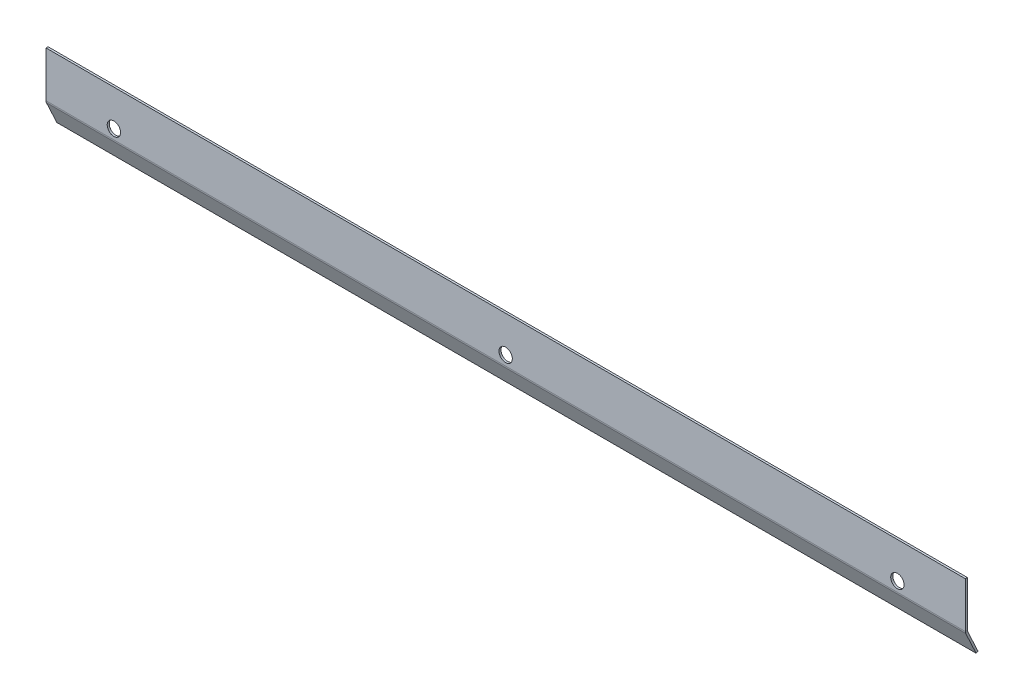
ISO-10303-21;
HEADER;
FILE_DESCRIPTION(('STEP AP214'),'2;1');
FILE_NAME('part.step','',(''),(''),'','','');
FILE_SCHEMA(('AUTOMOTIVE_DESIGN { 1 0 10303 214 1 1 1 1 }'));
ENDSEC;
DATA;
#1=APPLICATION_CONTEXT('core data for automotive mechanical design processes');
#2=APPLICATION_PROTOCOL_DEFINITION('international standard','automotive_design',2000,#1);
#3=PRODUCT_CONTEXT('',#1,'mechanical');
#4=PRODUCT('Part','Part','',(#3));
#5=PRODUCT_RELATED_PRODUCT_CATEGORY('part','',(#4));
#6=PRODUCT_DEFINITION_FORMATION('','',#4);
#7=PRODUCT_DEFINITION_CONTEXT('part definition',#1,'design');
#8=PRODUCT_DEFINITION('design','',#6,#7);
#9=PRODUCT_DEFINITION_SHAPE('','',#8);
#10=(LENGTH_UNIT() NAMED_UNIT(*) SI_UNIT(.MILLI.,.METRE.));
#11=(NAMED_UNIT(*) PLANE_ANGLE_UNIT() SI_UNIT($,.RADIAN.));
#12=(NAMED_UNIT(*) SI_UNIT($,.STERADIAN.) SOLID_ANGLE_UNIT());
#13=UNCERTAINTY_MEASURE_WITH_UNIT(LENGTH_MEASURE(1.E-05),#10,'distance_accuracy_value','');
#14=(GEOMETRIC_REPRESENTATION_CONTEXT(3) GLOBAL_UNCERTAINTY_ASSIGNED_CONTEXT((#13)) GLOBAL_UNIT_ASSIGNED_CONTEXT((#10,
#11,#12)) REPRESENTATION_CONTEXT('',''));
#15=CARTESIAN_POINT('',(0.,0.,0.));
#16=DIRECTION('',(0.,0.,1.));
#17=DIRECTION('',(1.,0.,0.));
#18=AXIS2_PLACEMENT_3D('',#15,#16,#17);
#19=CARTESIAN_POINT('',(-178.725,-9.,0.8));
#20=DIRECTION('',(0.,0.,1.));
#21=DIRECTION('',(1.,0.,0.));
#22=AXIS2_PLACEMENT_3D('',#19,#20,#21);
#23=PLANE('',#22);
#24=CARTESIAN_POINT('',(0.,-5.,0.8));
#25=DIRECTION('',(0.,0.,1.));
#26=DIRECTION('',(1.,0.,0.));
#27=AXIS2_PLACEMENT_3D('',#24,#25,#26);
#28=CIRCLE('',#27,2.6);
#29=CARTESIAN_POINT('',(2.6,-5.,0.8));
#30=VERTEX_POINT('',#29);
#31=EDGE_CURVE('E411',#30,#30,#28,.T.);
#32=ORIENTED_EDGE('',*,*,#31,.F.);
#33=EDGE_LOOP('',(#32));
#34=FACE_BOUND('',#33,.T.);
#35=CARTESIAN_POINT('',(-152.325,-5.,0.8));
#36=DIRECTION('',(0.,0.,1.));
#37=DIRECTION('',(1.,0.,0.));
#38=AXIS2_PLACEMENT_3D('',#35,#36,#37);
#39=CIRCLE('',#38,2.60000000000002);
#40=CARTESIAN_POINT('',(-149.725,-5.,0.8));
#41=VERTEX_POINT('',#40);
#42=EDGE_CURVE('E173',#41,#41,#39,.T.);
#43=ORIENTED_EDGE('',*,*,#42,.F.);
#44=EDGE_LOOP('',(#43));
#45=FACE_BOUND('',#44,.T.);
#46=CARTESIAN_POINT('',(152.325,-5.,0.8));
#47=DIRECTION('',(0.,0.,1.));
#48=DIRECTION('',(1.,0.,0.));
#49=AXIS2_PLACEMENT_3D('',#46,#47,#48);
#50=CIRCLE('',#49,2.60000000000002);
#51=CARTESIAN_POINT('',(154.925,-5.,0.8));
#52=VERTEX_POINT('',#51);
#53=EDGE_CURVE('E179',#52,#52,#50,.T.);
#54=ORIENTED_EDGE('',*,*,#53,.F.);
#55=EDGE_LOOP('',(#54));
#56=FACE_BOUND('',#55,.T.);
#57=DIRECTION('',(0.,-1.,0.));
#58=VECTOR('',#57,1.);
#59=CARTESIAN_POINT('',(-178.725,9.00000000000002,0.8));
#60=LINE('',#59,#58);
#61=CARTESIAN_POINT('',(-178.725,9.00000000000002,0.8));
#62=VERTEX_POINT('',#61);
#63=CARTESIAN_POINT('',(-178.725,-8.77830533735707,0.799999999999998));
#64=VERTEX_POINT('',#63);
#65=EDGE_CURVE('E185',#62,#64,#60,.T.);
#66=ORIENTED_EDGE('',*,*,#65,.T.);
#67=DIRECTION('',(-1.,0.,0.));
#68=VECTOR('',#67,1.);
#69=CARTESIAN_POINT('',(-178.725,-8.77830533735707,0.799999999999998));
#70=LINE('',#69,#68);
#71=CARTESIAN_POINT('',(178.725,-8.77830533735707,0.8));
#72=VERTEX_POINT('',#71);
#73=EDGE_CURVE('E116',#64,#72,#70,.F.);
#74=ORIENTED_EDGE('',*,*,#73,.T.);
#75=DIRECTION('',(0.,1.,0.));
#76=VECTOR('',#75,1.);
#77=CARTESIAN_POINT('',(178.725,9.,0.8));
#78=LINE('',#77,#76);
#79=CARTESIAN_POINT('',(178.725,9.,0.8));
#80=VERTEX_POINT('',#79);
#81=EDGE_CURVE('E187',#72,#80,#78,.T.);
#82=ORIENTED_EDGE('',*,*,#81,.T.);
#83=DIRECTION('',(-1.,0.,0.));
#84=VECTOR('',#83,1.);
#85=CARTESIAN_POINT('',(-178.725,9.00000000000002,0.8));
#86=LINE('',#85,#84);
#87=EDGE_CURVE('E58',#80,#62,#86,.T.);
#88=ORIENTED_EDGE('',*,*,#87,.T.);
#89=EDGE_LOOP('',(#66,#74,#82,#88));
#90=FACE_BOUND('',#89,.T.);
#91=ADVANCED_FACE('F40',(#34,#45,#56,#90),#23,.T.);
#92=CARTESIAN_POINT('',(-178.725,-9.,0.));
#93=DIRECTION('',(0.,0.,1.));
#94=DIRECTION('',(1.,0.,0.));
#95=AXIS2_PLACEMENT_3D('',#92,#93,#94);
#96=PLANE('',#95);
#97=CARTESIAN_POINT('',(0.,-5.,0.));
#98=DIRECTION('',(0.,0.,1.));
#99=DIRECTION('',(1.,0.,0.));
#100=AXIS2_PLACEMENT_3D('',#97,#98,#99);
#101=CIRCLE('',#100,2.6);
#102=CARTESIAN_POINT('',(2.6,-5.,0.));
#103=VERTEX_POINT('',#102);
#104=EDGE_CURVE('E44',#103,#103,#101,.T.);
#105=ORIENTED_EDGE('',*,*,#104,.T.);
#106=EDGE_LOOP('',(#105));
#107=FACE_BOUND('',#106,.T.);
#108=CARTESIAN_POINT('',(-152.325,-5.,0.));
#109=DIRECTION('',(0.,0.,1.));
#110=DIRECTION('',(-1.,0.,0.));
#111=AXIS2_PLACEMENT_3D('',#108,#109,#110);
#112=CIRCLE('',#111,2.60000000000002);
#113=CARTESIAN_POINT('',(-154.925,-5.,0.));
#114=VERTEX_POINT('',#113);
#115=EDGE_CURVE('E171',#114,#114,#112,.T.);
#116=ORIENTED_EDGE('',*,*,#115,.T.);
#117=EDGE_LOOP('',(#116));
#118=FACE_BOUND('',#117,.T.);
#119=CARTESIAN_POINT('',(152.325,-5.,0.));
#120=DIRECTION('',(0.,0.,1.));
#121=DIRECTION('',(1.,0.,0.));
#122=AXIS2_PLACEMENT_3D('',#119,#120,#121);
#123=CIRCLE('',#122,2.60000000000002);
#124=CARTESIAN_POINT('',(154.925,-5.,0.));
#125=VERTEX_POINT('',#124);
#126=EDGE_CURVE('E176',#125,#125,#123,.T.);
#127=ORIENTED_EDGE('',*,*,#126,.T.);
#128=EDGE_LOOP('',(#127));
#129=FACE_BOUND('',#128,.T.);
#130=DIRECTION('',(-1.,0.,0.));
#131=VECTOR('',#130,1.);
#132=CARTESIAN_POINT('',(-178.725,-8.77830533735707,0.));
#133=LINE('',#132,#131);
#134=CARTESIAN_POINT('',(-178.725,-8.77830533735707,0.));
#135=VERTEX_POINT('',#134);
#136=CARTESIAN_POINT('',(178.725,-8.77830533735707,0.));
#137=VERTEX_POINT('',#136);
#138=EDGE_CURVE('E166',#135,#137,#133,.F.);
#139=ORIENTED_EDGE('',*,*,#138,.F.);
#140=DIRECTION('',(0.,-1.,0.));
#141=VECTOR('',#140,1.);
#142=CARTESIAN_POINT('',(-178.725,9.00000000000002,0.));
#143=LINE('',#142,#141);
#144=CARTESIAN_POINT('',(-178.725,9.00000000000002,0.));
#145=VERTEX_POINT('',#144);
#146=EDGE_CURVE('E182',#145,#135,#143,.T.);
#147=ORIENTED_EDGE('',*,*,#146,.F.);
#148=DIRECTION('',(-1.,0.,0.));
#149=VECTOR('',#148,1.);
#150=CARTESIAN_POINT('',(-178.725,9.00000000000002,0.));
#151=LINE('',#150,#149);
#152=CARTESIAN_POINT('',(178.725,9.,0.));
#153=VERTEX_POINT('',#152);
#154=EDGE_CURVE('E188',#153,#145,#151,.T.);
#155=ORIENTED_EDGE('',*,*,#154,.F.);
#156=DIRECTION('',(0.,1.,0.));
#157=VECTOR('',#156,1.);
#158=CARTESIAN_POINT('',(178.725,9.,0.));
#159=LINE('',#158,#157);
#160=EDGE_CURVE('E69',#137,#153,#159,.T.);
#161=ORIENTED_EDGE('',*,*,#160,.F.);
#162=EDGE_LOOP('',(#139,#147,#155,#161));
#163=FACE_BOUND('',#162,.T.);
#164=ADVANCED_FACE('F203',(#107,#118,#129,#163),#96,.F.);
#165=CARTESIAN_POINT('',(-178.725,9.00000000000002,0.8));
#166=DIRECTION('',(1.,0.,0.));
#167=DIRECTION('',(0.,0.,-1.));
#168=AXIS2_PLACEMENT_3D('',#165,#166,#167);
#169=PLANE('',#168);
#170=DIRECTION('',(0.,0.,1.));
#171=VECTOR('',#170,1.);
#172=CARTESIAN_POINT('',(-178.725,-8.77830533735707,0.));
#173=LINE('',#172,#171);
#174=EDGE_CURVE('E162',#135,#64,#173,.T.);
#175=ORIENTED_EDGE('',*,*,#174,.T.);
#176=ORIENTED_EDGE('',*,*,#65,.F.);
#177=DIRECTION('',(0.,0.,-1.));
#178=VECTOR('',#177,1.);
#179=CARTESIAN_POINT('',(-178.725,9.00000000000002,0.8));
#180=LINE('',#179,#178);
#181=EDGE_CURVE('E50',#62,#145,#180,.T.);
#182=ORIENTED_EDGE('',*,*,#181,.T.);
#183=ORIENTED_EDGE('',*,*,#146,.T.);
#184=EDGE_LOOP('',(#175,#176,#182,#183));
#185=FACE_BOUND('',#184,.T.);
#186=ADVANCED_FACE('F42',(#185),#169,.F.);
#187=CARTESIAN_POINT('',(178.725,9.,0.8));
#188=DIRECTION('',(-1.,0.,0.));
#189=DIRECTION('',(0.,0.,1.));
#190=AXIS2_PLACEMENT_3D('',#187,#188,#189);
#191=PLANE('',#190);
#192=DIRECTION('',(0.,0.,1.));
#193=VECTOR('',#192,1.);
#194=CARTESIAN_POINT('',(178.725,-8.77830533735707,0.));
#195=LINE('',#194,#193);
#196=EDGE_CURVE('E169',#137,#72,#195,.T.);
#197=ORIENTED_EDGE('',*,*,#196,.F.);
#198=ORIENTED_EDGE('',*,*,#160,.T.);
#199=DIRECTION('',(0.,0.,-1.));
#200=VECTOR('',#199,1.);
#201=CARTESIAN_POINT('',(178.725,9.,0.8));
#202=LINE('',#201,#200);
#203=EDGE_CURVE('E11',#80,#153,#202,.T.);
#204=ORIENTED_EDGE('',*,*,#203,.F.);
#205=ORIENTED_EDGE('',*,*,#81,.F.);
#206=EDGE_LOOP('',(#197,#198,#204,#205));
#207=FACE_BOUND('',#206,.T.);
#208=ADVANCED_FACE('F213',(#207),#191,.F.);
#209=CARTESIAN_POINT('',(-178.725,9.00000000000002,0.8));
#210=DIRECTION('',(0.,-1.,0.));
#211=DIRECTION('',(1.,0.,0.));
#212=AXIS2_PLACEMENT_3D('',#209,#210,#211);
#213=PLANE('',#212);
#214=ORIENTED_EDGE('',*,*,#154,.T.);
#215=ORIENTED_EDGE('',*,*,#181,.F.);
#216=ORIENTED_EDGE('',*,*,#87,.F.);
#217=ORIENTED_EDGE('',*,*,#203,.T.);
#218=EDGE_LOOP('',(#214,#215,#216,#217));
#219=FACE_BOUND('',#218,.T.);
#220=ADVANCED_FACE('F228',(#219),#213,.F.);
#221=CARTESIAN_POINT('',(152.325,-5.,0.));
#222=DIRECTION('',(0.,0.,1.));
#223=DIRECTION('',(1.,0.,0.));
#224=AXIS2_PLACEMENT_3D('',#221,#222,#223);
#225=CYLINDRICAL_SURFACE('',#224,2.60000000000002);
#226=ORIENTED_EDGE('',*,*,#53,.T.);
#227=EDGE_LOOP('',(#226));
#228=FACE_BOUND('',#227,.T.);
#229=ORIENTED_EDGE('',*,*,#126,.F.);
#230=EDGE_LOOP('',(#229));
#231=FACE_BOUND('',#230,.T.);
#232=ADVANCED_FACE('F225',(#228,#231),#225,.F.);
#233=CARTESIAN_POINT('',(-152.325,-5.,0.));
#234=DIRECTION('',(0.,0.,1.));
#235=DIRECTION('',(1.,0.,0.));
#236=AXIS2_PLACEMENT_3D('',#233,#234,#235);
#237=CYLINDRICAL_SURFACE('',#236,2.60000000000002);
#238=ORIENTED_EDGE('',*,*,#42,.T.);
#239=EDGE_LOOP('',(#238));
#240=FACE_BOUND('',#239,.T.);
#241=ORIENTED_EDGE('',*,*,#115,.F.);
#242=EDGE_LOOP('',(#241));
#243=FACE_BOUND('',#242,.T.);
#244=ADVANCED_FACE('F317',(#240,#243),#237,.F.);
#245=CARTESIAN_POINT('',(178.725,-8.77830533735707,-1.));
#246=DIRECTION('',(1.,0.,0.));
#247=DIRECTION('',(0.,0.,-1.));
#248=AXIS2_PLACEMENT_3D('',#245,#246,#247);
#249=PLANE('',#248);
#250=DIRECTION('',(0.,-0.422618261740694,0.906307787036653));
#251=VECTOR('',#250,1.);
#252=CARTESIAN_POINT('',(178.725,-9.20092359909776,-0.0936922129633482));
#253=LINE('',#252,#251);
#254=CARTESIAN_POINT('',(178.725,-9.20092359909776,-0.093692212963349));
#255=VERTEX_POINT('',#254);
#256=CARTESIAN_POINT('',(178.725,-9.53901820849032,0.631354016665973));
#257=VERTEX_POINT('',#256);
#258=EDGE_CURVE('E212',#255,#257,#253,.T.);
#259=ORIENTED_EDGE('',*,*,#258,.F.);
#260=CARTESIAN_POINT('',(178.725,-8.77830533735707,-1.));
#261=DIRECTION('',(-1.,0.,0.));
#262=DIRECTION('',(0.,0.,1.));
#263=AXIS2_PLACEMENT_3D('',#260,#261,#262);
#264=CIRCLE('',#263,0.999999999999998);
#265=EDGE_CURVE('E119',#137,#255,#264,.F.);
#266=ORIENTED_EDGE('',*,*,#265,.F.);
#267=ORIENTED_EDGE('',*,*,#196,.T.);
#268=CARTESIAN_POINT('',(178.725,-8.77830533735707,-1.));
#269=DIRECTION('',(-1.,0.,0.));
#270=DIRECTION('',(0.,0.,1.));
#271=AXIS2_PLACEMENT_3D('',#268,#269,#270);
#272=CIRCLE('',#271,1.8);
#273=EDGE_CURVE('E77',#72,#257,#272,.F.);
#274=ORIENTED_EDGE('',*,*,#273,.T.);
#275=EDGE_LOOP('',(#259,#266,#267,#274));
#276=FACE_BOUND('',#275,.T.);
#277=ADVANCED_FACE('F209',(#276),#249,.T.);
#278=CARTESIAN_POINT('',(-178.725,-8.77830533735707,-1.));
#279=DIRECTION('',(1.,0.,0.));
#280=DIRECTION('',(0.,0.,-1.));
#281=AXIS2_PLACEMENT_3D('',#278,#279,#280);
#282=PLANE('',#281);
#283=CARTESIAN_POINT('',(-178.725,-8.77830533735707,-1.));
#284=DIRECTION('',(-1.,0.,0.));
#285=DIRECTION('',(0.,0.,1.));
#286=AXIS2_PLACEMENT_3D('',#283,#284,#285);
#287=CIRCLE('',#286,0.999999999999998);
#288=CARTESIAN_POINT('',(-178.725,-9.20092359909776,-0.093692212963349));
#289=VERTEX_POINT('',#288);
#290=EDGE_CURVE('E126',#289,#135,#287,.T.);
#291=ORIENTED_EDGE('',*,*,#290,.F.);
#292=DIRECTION('',(0.,-0.422618261740694,0.906307787036653));
#293=VECTOR('',#292,1.);
#294=CARTESIAN_POINT('',(-178.725,-9.20092359909776,-0.093692212963349));
#295=LINE('',#294,#293);
#296=CARTESIAN_POINT('',(-178.725,-9.53901820849032,0.631354016665973));
#297=VERTEX_POINT('',#296);
#298=EDGE_CURVE('E123',#289,#297,#295,.T.);
#299=ORIENTED_EDGE('',*,*,#298,.T.);
#300=CARTESIAN_POINT('',(-178.725,-8.77830533735707,-1.));
#301=DIRECTION('',(-1.,0.,0.));
#302=DIRECTION('',(0.,0.,1.));
#303=AXIS2_PLACEMENT_3D('',#300,#301,#302);
#304=CIRCLE('',#303,1.8);
#305=EDGE_CURVE('E110',#297,#64,#304,.T.);
#306=ORIENTED_EDGE('',*,*,#305,.T.);
#307=ORIENTED_EDGE('',*,*,#174,.F.);
#308=EDGE_LOOP('',(#291,#299,#306,#307));
#309=FACE_BOUND('',#308,.T.);
#310=ADVANCED_FACE('F124',(#309),#282,.F.);
#311=CARTESIAN_POINT('',(-178.725,-8.77830533735707,-1.));
#312=DIRECTION('',(-1.,0.,0.));
#313=DIRECTION('',(0.,-0.422618261740694,0.906307787036653));
#314=AXIS2_PLACEMENT_3D('',#311,#312,#313);
#315=CYLINDRICAL_SURFACE('',#314,1.8);
#316=ORIENTED_EDGE('',*,*,#73,.F.);
#317=ORIENTED_EDGE('',*,*,#305,.F.);
#318=DIRECTION('',(1.,0.,0.));
#319=VECTOR('',#318,1.);
#320=CARTESIAN_POINT('',(-178.725,-9.53901820849032,0.631354016665972));
#321=LINE('',#320,#319);
#322=EDGE_CURVE('E114',#297,#257,#321,.T.);
#323=ORIENTED_EDGE('',*,*,#322,.T.);
#324=ORIENTED_EDGE('',*,*,#273,.F.);
#325=EDGE_LOOP('',(#316,#317,#323,#324));
#326=FACE_BOUND('',#325,.T.);
#327=ADVANCED_FACE('F112',(#326),#315,.T.);
#328=CARTESIAN_POINT('',(-178.725,-8.77830533735707,-1.));
#329=DIRECTION('',(-1.,0.,0.));
#330=DIRECTION('',(0.,-0.422618261740694,0.906307787036653));
#331=AXIS2_PLACEMENT_3D('',#328,#329,#330);
#332=CYLINDRICAL_SURFACE('',#331,0.999999999999998);
#333=ORIENTED_EDGE('',*,*,#138,.T.);
#334=ORIENTED_EDGE('',*,*,#265,.T.);
#335=DIRECTION('',(-1.,0.,0.));
#336=VECTOR('',#335,1.);
#337=CARTESIAN_POINT('',(178.725,-9.20092359909776,-0.0936922129633482));
#338=LINE('',#337,#336);
#339=EDGE_CURVE('E130',#255,#289,#338,.T.);
#340=ORIENTED_EDGE('',*,*,#339,.T.);
#341=ORIENTED_EDGE('',*,*,#290,.T.);
#342=EDGE_LOOP('',(#333,#334,#340,#341));
#343=FACE_BOUND('',#342,.T.);
#344=ADVANCED_FACE('F206',(#343),#332,.F.);
#345=CARTESIAN_POINT('',(-178.725,-18.2404336004809,-3.42618261740694));
#346=DIRECTION('',(1.,0.,0.));
#347=DIRECTION('',(0.,0.,-1.));
#348=AXIS2_PLACEMENT_3D('',#345,#346,#347);
#349=PLANE('',#348);
#350=ORIENTED_EDGE('',*,*,#298,.F.);
#351=DIRECTION('',(0.,-0.906307787036653,-0.422618261740694));
#352=VECTOR('',#351,1.);
#353=CARTESIAN_POINT('',(-178.725,-17.9023389910883,-4.15122884703626));
#354=LINE('',#353,#352);
#355=CARTESIAN_POINT('',(-178.725,-17.9023389910883,-4.15122884703626));
#356=VERTEX_POINT('',#355);
#357=EDGE_CURVE('E139',#289,#356,#354,.T.);
#358=ORIENTED_EDGE('',*,*,#357,.T.);
#359=DIRECTION('',(0.,0.422618261740694,-0.906307787036653));
#360=VECTOR('',#359,1.);
#361=CARTESIAN_POINT('',(-178.725,-18.2404336004809,-3.42618261740694));
#362=LINE('',#361,#360);
#363=CARTESIAN_POINT('',(-178.725,-18.2404336004809,-3.42618261740694));
#364=VERTEX_POINT('',#363);
#365=EDGE_CURVE('E144',#364,#356,#362,.T.);
#366=ORIENTED_EDGE('',*,*,#365,.F.);
#367=DIRECTION('',(0.,-0.906307787036653,-0.422618261740694));
#368=VECTOR('',#367,1.);
#369=CARTESIAN_POINT('',(-178.725,-18.2404336004809,-3.42618261740694));
#370=LINE('',#369,#368);
#371=EDGE_CURVE('E135',#297,#364,#370,.T.);
#372=ORIENTED_EDGE('',*,*,#371,.F.);
#373=EDGE_LOOP('',(#350,#358,#366,#372));
#374=FACE_BOUND('',#373,.T.);
#375=ADVANCED_FACE('F142',(#374),#349,.F.);
#376=CARTESIAN_POINT('',(178.725,-9.33809460939256,0.725046229629321));
#377=DIRECTION('',(-1.,0.,0.));
#378=DIRECTION('',(0.,0.,1.));
#379=AXIS2_PLACEMENT_3D('',#376,#377,#378);
#380=PLANE('',#379);
#381=ORIENTED_EDGE('',*,*,#258,.T.);
#382=DIRECTION('',(0.,0.906307787036653,0.422618261740694));
#383=VECTOR('',#382,1.);
#384=CARTESIAN_POINT('',(178.725,-9.33809460939256,0.725046229629321));
#385=LINE('',#384,#383);
#386=CARTESIAN_POINT('',(178.725,-18.2404336004809,-3.42618261740694));
#387=VERTEX_POINT('',#386);
#388=EDGE_CURVE('E138',#387,#257,#385,.T.);
#389=ORIENTED_EDGE('',*,*,#388,.F.);
#390=DIRECTION('',(0.,0.422618261740694,-0.906307787036653));
#391=VECTOR('',#390,1.);
#392=CARTESIAN_POINT('',(178.725,-18.2404336004809,-3.42618261740694));
#393=LINE('',#392,#391);
#394=CARTESIAN_POINT('',(178.725,-17.9023389910883,-4.15122884703626));
#395=VERTEX_POINT('',#394);
#396=EDGE_CURVE('E155',#387,#395,#393,.T.);
#397=ORIENTED_EDGE('',*,*,#396,.T.);
#398=DIRECTION('',(0.,0.906307787036653,0.422618261740694));
#399=VECTOR('',#398,1.);
#400=CARTESIAN_POINT('',(178.725,-9.,0.));
#401=LINE('',#400,#399);
#402=EDGE_CURVE('E146',#395,#255,#401,.T.);
#403=ORIENTED_EDGE('',*,*,#402,.T.);
#404=EDGE_LOOP('',(#381,#389,#397,#403));
#405=FACE_BOUND('',#404,.T.);
#406=ADVANCED_FACE('F279',(#405),#380,.F.);
#407=CARTESIAN_POINT('',(-178.725,-9.33809460939256,0.725046229629321));
#408=DIRECTION('',(0.,0.422618261740694,-0.906307787036653));
#409=DIRECTION('',(0.,0.906307787036653,0.422618261740694));
#410=AXIS2_PLACEMENT_3D('',#407,#408,#409);
#411=PLANE('',#410);
#412=ORIENTED_EDGE('',*,*,#322,.F.);
#413=ORIENTED_EDGE('',*,*,#371,.T.);
#414=DIRECTION('',(1.,0.,0.));
#415=VECTOR('',#414,1.);
#416=CARTESIAN_POINT('',(178.725,-18.2404336004809,-3.42618261740694));
#417=LINE('',#416,#415);
#418=EDGE_CURVE('E145',#364,#387,#417,.T.);
#419=ORIENTED_EDGE('',*,*,#418,.T.);
#420=ORIENTED_EDGE('',*,*,#388,.T.);
#421=EDGE_LOOP('',(#412,#413,#419,#420));
#422=FACE_BOUND('',#421,.T.);
#423=ADVANCED_FACE('F134',(#422),#411,.F.);
#424=CARTESIAN_POINT('',(-178.725,-9.,0.));
#425=DIRECTION('',(0.,0.422618261740694,-0.906307787036653));
#426=DIRECTION('',(0.,0.906307787036653,0.422618261740694));
#427=AXIS2_PLACEMENT_3D('',#424,#425,#426);
#428=PLANE('',#427);
#429=ORIENTED_EDGE('',*,*,#357,.F.);
#430=ORIENTED_EDGE('',*,*,#339,.F.);
#431=ORIENTED_EDGE('',*,*,#402,.F.);
#432=DIRECTION('',(1.,0.,0.));
#433=VECTOR('',#432,1.);
#434=CARTESIAN_POINT('',(178.725,-17.9023389910883,-4.15122884703626));
#435=LINE('',#434,#433);
#436=EDGE_CURVE('E150',#356,#395,#435,.T.);
#437=ORIENTED_EDGE('',*,*,#436,.F.);
#438=EDGE_LOOP('',(#429,#430,#431,#437));
#439=FACE_BOUND('',#438,.T.);
#440=ADVANCED_FACE('F265',(#439),#428,.T.);
#441=CARTESIAN_POINT('',(178.725,-18.2404336004809,-3.42618261740694));
#442=DIRECTION('',(0.,0.906307787036652,0.422618261740694));
#443=DIRECTION('',(0.,-0.422618261740694,0.906307787036653));
#444=AXIS2_PLACEMENT_3D('',#441,#442,#443);
#445=PLANE('',#444);
#446=ORIENTED_EDGE('',*,*,#436,.T.);
#447=ORIENTED_EDGE('',*,*,#396,.F.);
#448=ORIENTED_EDGE('',*,*,#418,.F.);
#449=ORIENTED_EDGE('',*,*,#365,.T.);
#450=EDGE_LOOP('',(#446,#447,#448,#449));
#451=FACE_BOUND('',#450,.T.);
#452=ADVANCED_FACE('F254',(#451),#445,.F.);
#453=CARTESIAN_POINT('',(0.,-5.,-9.2));
#454=DIRECTION('',(0.,0.,1.));
#455=DIRECTION('',(1.,0.,0.));
#456=AXIS2_PLACEMENT_3D('',#453,#454,#455);
#457=CYLINDRICAL_SURFACE('',#456,2.6);
#458=ORIENTED_EDGE('',*,*,#31,.T.);
#459=EDGE_LOOP('',(#458));
#460=FACE_BOUND('',#459,.T.);
#461=ORIENTED_EDGE('',*,*,#104,.F.);
#462=EDGE_LOOP('',(#461));
#463=FACE_BOUND('',#462,.T.);
#464=ADVANCED_FACE('F250',(#460,#463),#457,.F.);
#465=CLOSED_SHELL('',(#91,#164,#186,#208,#220,#232,#244,#277,#310,#327,#344,#375,#406,#423,#440,
#452,#464));
#466=MANIFOLD_SOLID_BREP('B2',#465);
#467=ADVANCED_BREP_SHAPE_REPRESENTATION('',(#18,#466),#14);
#468=SHAPE_DEFINITION_REPRESENTATION(#9,#467);
ENDSEC;
END-ISO-10303-21;
